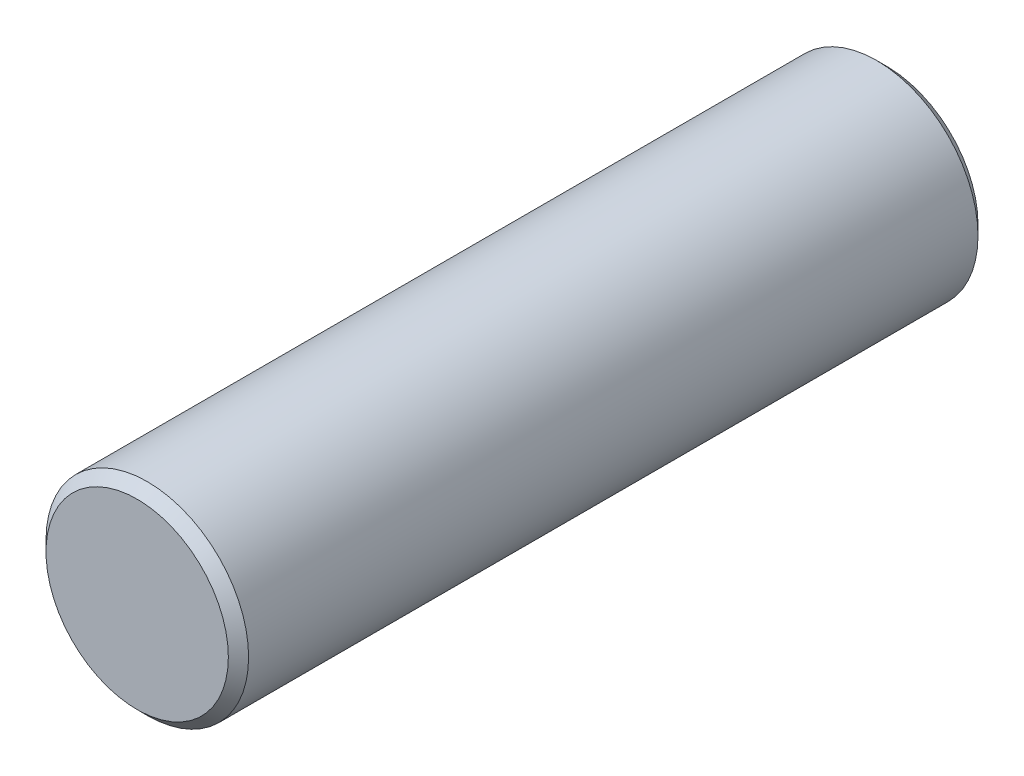
ISO-10303-21;
HEADER;
FILE_DESCRIPTION(('STEP AP214'),'2;1');
FILE_NAME('part.step','',(''),(''),'','','');
FILE_SCHEMA(('AUTOMOTIVE_DESIGN { 1 0 10303 214 1 1 1 1 }'));
ENDSEC;
DATA;
#1=APPLICATION_CONTEXT('core data for automotive mechanical design processes');
#2=APPLICATION_PROTOCOL_DEFINITION('international standard','automotive_design',2000,#1);
#3=PRODUCT_CONTEXT('',#1,'mechanical');
#4=PRODUCT('Part','Part','',(#3));
#5=PRODUCT_RELATED_PRODUCT_CATEGORY('part','',(#4));
#6=PRODUCT_DEFINITION_FORMATION('','',#4);
#7=PRODUCT_DEFINITION_CONTEXT('part definition',#1,'design');
#8=PRODUCT_DEFINITION('design','',#6,#7);
#9=PRODUCT_DEFINITION_SHAPE('','',#8);
#10=(LENGTH_UNIT() NAMED_UNIT(*) SI_UNIT(.MILLI.,.METRE.));
#11=(NAMED_UNIT(*) PLANE_ANGLE_UNIT() SI_UNIT($,.RADIAN.));
#12=(NAMED_UNIT(*) SI_UNIT($,.STERADIAN.) SOLID_ANGLE_UNIT());
#13=UNCERTAINTY_MEASURE_WITH_UNIT(LENGTH_MEASURE(1.E-05),#10,'distance_accuracy_value','');
#14=(GEOMETRIC_REPRESENTATION_CONTEXT(3) GLOBAL_UNCERTAINTY_ASSIGNED_CONTEXT((#13)) GLOBAL_UNIT_ASSIGNED_CONTEXT((#10,
#11,#12)) REPRESENTATION_CONTEXT('',''));
#15=CARTESIAN_POINT('',(0.,0.,0.));
#16=DIRECTION('',(0.,0.,1.));
#17=DIRECTION('',(1.,0.,0.));
#18=AXIS2_PLACEMENT_3D('',#15,#16,#17);
#19=CARTESIAN_POINT('',(0.,0.,1879.6));
#20=DIRECTION('',(0.,0.,-1.));
#21=DIRECTION('',(-1.,0.,0.));
#22=AXIS2_PLACEMENT_3D('',#19,#20,#21);
#23=CYLINDRICAL_SURFACE('',#22,254.);
#24=CARTESIAN_POINT('',(0.,0.,25.3999999999999));
#25=DIRECTION('',(0.,0.,1.));
#26=DIRECTION('',(1.,0.,0.));
#27=AXIS2_PLACEMENT_3D('',#24,#25,#26);
#28=CIRCLE('',#27,254.);
#29=CARTESIAN_POINT('',(254.,0.,25.3999999999999));
#30=VERTEX_POINT('',#29);
#31=EDGE_CURVE('E56',#30,#30,#28,.T.);
#32=ORIENTED_EDGE('',*,*,#31,.T.);
#33=EDGE_LOOP('',(#32));
#34=FACE_BOUND('',#33,.T.);
#35=CARTESIAN_POINT('',(0.,0.,1854.2));
#36=DIRECTION('',(0.,0.,1.));
#37=DIRECTION('',(1.,0.,0.));
#38=AXIS2_PLACEMENT_3D('',#35,#36,#37);
#39=CIRCLE('',#38,254.);
#40=CARTESIAN_POINT('',(254.,0.,1854.2));
#41=VERTEX_POINT('',#40);
#42=EDGE_CURVE('E61',#41,#41,#39,.F.);
#43=ORIENTED_EDGE('',*,*,#42,.T.);
#44=EDGE_LOOP('',(#43));
#45=FACE_BOUND('',#44,.T.);
#46=ADVANCED_FACE('F44',(#34,#45),#23,.T.);
#47=CARTESIAN_POINT('',(0.,0.,1879.6));
#48=DIRECTION('',(0.,0.,1.));
#49=DIRECTION('',(1.,0.,0.));
#50=AXIS2_PLACEMENT_3D('',#47,#48,#49);
#51=PLANE('',#50);
#52=CARTESIAN_POINT('',(0.,0.,1879.6));
#53=DIRECTION('',(0.,0.,1.));
#54=DIRECTION('',(1.,0.,0.));
#55=AXIS2_PLACEMENT_3D('',#52,#53,#54);
#56=CIRCLE('',#55,228.6);
#57=CARTESIAN_POINT('',(228.6,0.,1879.6));
#58=VERTEX_POINT('',#57);
#59=EDGE_CURVE('E10',#58,#58,#56,.T.);
#60=ORIENTED_EDGE('',*,*,#59,.T.);
#61=EDGE_LOOP('',(#60));
#62=FACE_BOUND('',#61,.T.);
#63=ADVANCED_FACE('F82',(#62),#51,.T.);
#64=CARTESIAN_POINT('',(0.,0.,0.));
#65=DIRECTION('',(0.,0.,1.));
#66=DIRECTION('',(1.,0.,0.));
#67=AXIS2_PLACEMENT_3D('',#64,#65,#66);
#68=PLANE('',#67);
#69=CARTESIAN_POINT('',(0.,0.,0.));
#70=DIRECTION('',(0.,0.,1.));
#71=DIRECTION('',(1.,0.,0.));
#72=AXIS2_PLACEMENT_3D('',#69,#70,#71);
#73=CIRCLE('',#72,228.6);
#74=CARTESIAN_POINT('',(228.6,0.,0.));
#75=VERTEX_POINT('',#74);
#76=EDGE_CURVE('E53',#75,#75,#73,.F.);
#77=ORIENTED_EDGE('',*,*,#76,.T.);
#78=EDGE_LOOP('',(#77));
#79=FACE_BOUND('',#78,.T.);
#80=ADVANCED_FACE('F79',(#79),#68,.F.);
#81=CARTESIAN_POINT('',(0.,0.,25.3999999999999));
#82=DIRECTION('',(0.,0.,1.));
#83=DIRECTION('',(1.,0.,0.));
#84=AXIS2_PLACEMENT_3D('',#81,#82,#83);
#85=CONICAL_SURFACE('',#84,254.,0.785398163397453);
#86=ORIENTED_EDGE('',*,*,#76,.F.);
#87=EDGE_LOOP('',(#86));
#88=FACE_BOUND('',#87,.T.);
#89=ORIENTED_EDGE('',*,*,#31,.F.);
#90=EDGE_LOOP('',(#89));
#91=FACE_BOUND('',#90,.T.);
#92=ADVANCED_FACE('F74',(#88,#91),#85,.T.);
#93=CARTESIAN_POINT('',(0.,0.,1879.6));
#94=DIRECTION('',(0.,0.,-1.));
#95=DIRECTION('',(-1.,0.,0.));
#96=AXIS2_PLACEMENT_3D('',#93,#94,#95);
#97=CONICAL_SURFACE('',#96,228.6,0.785398163397444);
#98=ORIENTED_EDGE('',*,*,#42,.F.);
#99=EDGE_LOOP('',(#98));
#100=FACE_BOUND('',#99,.T.);
#101=ORIENTED_EDGE('',*,*,#59,.F.);
#102=EDGE_LOOP('',(#101));
#103=FACE_BOUND('',#102,.T.);
#104=ADVANCED_FACE('F48',(#100,#103),#97,.T.);
#105=CLOSED_SHELL('',(#46,#63,#80,#92,#104));
#106=MANIFOLD_SOLID_BREP('B2',#105);
#107=ADVANCED_BREP_SHAPE_REPRESENTATION('',(#18,#106),#14);
#108=SHAPE_DEFINITION_REPRESENTATION(#9,#107);
ENDSEC;
END-ISO-10303-21;
